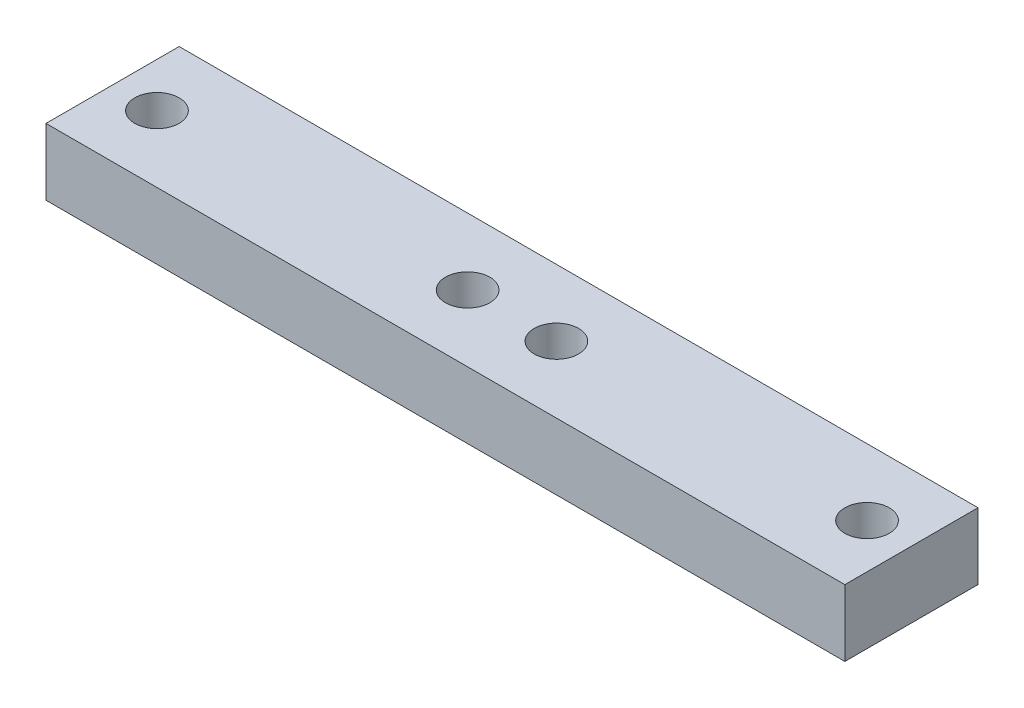
ISO-10303-21;
HEADER;
FILE_DESCRIPTION(('STEP AP214'),'2;1');
FILE_NAME('part.step','',(''),(''),'','','');
FILE_SCHEMA(('AUTOMOTIVE_DESIGN { 1 0 10303 214 1 1 1 1 }'));
ENDSEC;
DATA;
#1=APPLICATION_CONTEXT('core data for automotive mechanical design processes');
#2=APPLICATION_PROTOCOL_DEFINITION('international standard','automotive_design',2000,#1);
#3=PRODUCT_CONTEXT('',#1,'mechanical');
#4=PRODUCT('Part','Part','',(#3));
#5=PRODUCT_RELATED_PRODUCT_CATEGORY('part','',(#4));
#6=PRODUCT_DEFINITION_FORMATION('','',#4);
#7=PRODUCT_DEFINITION_CONTEXT('part definition',#1,'design');
#8=PRODUCT_DEFINITION('design','',#6,#7);
#9=PRODUCT_DEFINITION_SHAPE('','',#8);
#10=(LENGTH_UNIT() NAMED_UNIT(*) SI_UNIT(.MILLI.,.METRE.));
#11=(NAMED_UNIT(*) PLANE_ANGLE_UNIT() SI_UNIT($,.RADIAN.));
#12=(NAMED_UNIT(*) SI_UNIT($,.STERADIAN.) SOLID_ANGLE_UNIT());
#13=UNCERTAINTY_MEASURE_WITH_UNIT(LENGTH_MEASURE(1.E-05),#10,'distance_accuracy_value','');
#14=(GEOMETRIC_REPRESENTATION_CONTEXT(3) GLOBAL_UNCERTAINTY_ASSIGNED_CONTEXT((#13)) GLOBAL_UNIT_ASSIGNED_CONTEXT((#10,
#11,#12)) REPRESENTATION_CONTEXT('',''));
#15=CARTESIAN_POINT('',(0.,0.,0.));
#16=DIRECTION('',(0.,0.,1.));
#17=DIRECTION('',(1.,0.,0.));
#18=AXIS2_PLACEMENT_3D('',#15,#16,#17);
#19=CARTESIAN_POINT('',(0.,6.,0.));
#20=DIRECTION('',(0.,1.,0.));
#21=DIRECTION('',(0.,0.,1.));
#22=AXIS2_PLACEMENT_3D('',#19,#20,#21);
#23=PLANE('',#22);
#24=CARTESIAN_POINT('',(-4.,6.,0.));
#25=DIRECTION('',(0.,1.,0.));
#26=DIRECTION('',(0.,0.,-1.));
#27=AXIS2_PLACEMENT_3D('',#24,#25,#26);
#28=CIRCLE('',#27,2.);
#29=CARTESIAN_POINT('',(-4.,6.,-2.));
#30=VERTEX_POINT('',#29);
#31=EDGE_CURVE('E142',#30,#30,#28,.T.);
#32=ORIENTED_EDGE('',*,*,#31,.F.);
#33=EDGE_LOOP('',(#32));
#34=FACE_BOUND('',#33,.T.);
#35=CARTESIAN_POINT('',(32.,6.,0.));
#36=DIRECTION('',(0.,1.,0.));
#37=DIRECTION('',(0.,0.,1.));
#38=AXIS2_PLACEMENT_3D('',#35,#36,#37);
#39=CIRCLE('',#38,2.);
#40=CARTESIAN_POINT('',(32.,6.,2.));
#41=VERTEX_POINT('',#40);
#42=EDGE_CURVE('E112',#41,#41,#39,.T.);
#43=ORIENTED_EDGE('',*,*,#42,.F.);
#44=EDGE_LOOP('',(#43));
#45=FACE_BOUND('',#44,.T.);
#46=DIRECTION('',(0.,0.,1.));
#47=VECTOR('',#46,1.);
#48=CARTESIAN_POINT('',(-36.,6.,6.));
#49=LINE('',#48,#47);
#50=CARTESIAN_POINT('',(-36.,6.,-6.));
#51=VERTEX_POINT('',#50);
#52=CARTESIAN_POINT('',(-36.,6.,6.));
#53=VERTEX_POINT('',#52);
#54=EDGE_CURVE('E92',#51,#53,#49,.T.);
#55=ORIENTED_EDGE('',*,*,#54,.T.);
#56=DIRECTION('',(1.,0.,0.));
#57=VECTOR('',#56,1.);
#58=CARTESIAN_POINT('',(36.,6.,6.00000000000001));
#59=LINE('',#58,#57);
#60=CARTESIAN_POINT('',(36.,6.,6.00000000000001));
#61=VERTEX_POINT('',#60);
#62=EDGE_CURVE('E87',#53,#61,#59,.T.);
#63=ORIENTED_EDGE('',*,*,#62,.T.);
#64=DIRECTION('',(0.,0.,-1.));
#65=VECTOR('',#64,1.);
#66=CARTESIAN_POINT('',(36.,6.,6.00000000000001));
#67=LINE('',#66,#65);
#68=CARTESIAN_POINT('',(36.,6.,-6.00000000000001));
#69=VERTEX_POINT('',#68);
#70=EDGE_CURVE('E90',#61,#69,#67,.T.);
#71=ORIENTED_EDGE('',*,*,#70,.T.);
#72=DIRECTION('',(-1.,0.,0.));
#73=VECTOR('',#72,1.);
#74=CARTESIAN_POINT('',(36.,6.,-6.00000000000001));
#75=LINE('',#74,#73);
#76=EDGE_CURVE('E57',#69,#51,#75,.T.);
#77=ORIENTED_EDGE('',*,*,#76,.T.);
#78=EDGE_LOOP('',(#55,#63,#71,#77));
#79=FACE_BOUND('',#78,.T.);
#80=CARTESIAN_POINT('',(4.,6.,0.));
#81=DIRECTION('',(0.,1.,0.));
#82=DIRECTION('',(0.,0.,1.));
#83=AXIS2_PLACEMENT_3D('',#80,#81,#82);
#84=CIRCLE('',#83,2.);
#85=CARTESIAN_POINT('',(4.,6.,2.));
#86=VERTEX_POINT('',#85);
#87=EDGE_CURVE('E134',#86,#86,#84,.T.);
#88=ORIENTED_EDGE('',*,*,#87,.F.);
#89=EDGE_LOOP('',(#88));
#90=FACE_BOUND('',#89,.T.);
#91=CARTESIAN_POINT('',(-32.,6.,0.));
#92=DIRECTION('',(0.,1.,0.));
#93=DIRECTION('',(0.,0.,-1.));
#94=AXIS2_PLACEMENT_3D('',#91,#92,#93);
#95=CIRCLE('',#94,2.);
#96=CARTESIAN_POINT('',(-32.,6.,-2.));
#97=VERTEX_POINT('',#96);
#98=EDGE_CURVE('E150',#97,#97,#95,.T.);
#99=ORIENTED_EDGE('',*,*,#98,.F.);
#100=EDGE_LOOP('',(#99));
#101=FACE_BOUND('',#100,.T.);
#102=ADVANCED_FACE('F39',(#34,#45,#79,#90,#101),#23,.T.);
#103=CARTESIAN_POINT('',(0.,0.,0.));
#104=DIRECTION('',(0.,1.,0.));
#105=DIRECTION('',(0.,0.,1.));
#106=AXIS2_PLACEMENT_3D('',#103,#104,#105);
#107=PLANE('',#106);
#108=DIRECTION('',(0.,0.,1.));
#109=VECTOR('',#108,1.);
#110=CARTESIAN_POINT('',(-36.,0.,6.));
#111=LINE('',#110,#109);
#112=CARTESIAN_POINT('',(-36.,0.,-6.));
#113=VERTEX_POINT('',#112);
#114=CARTESIAN_POINT('',(-36.,0.,6.));
#115=VERTEX_POINT('',#114);
#116=EDGE_CURVE('E108',#113,#115,#111,.T.);
#117=ORIENTED_EDGE('',*,*,#116,.F.);
#118=DIRECTION('',(-1.,0.,0.));
#119=VECTOR('',#118,1.);
#120=CARTESIAN_POINT('',(36.,0.,-6.00000000000001));
#121=LINE('',#120,#119);
#122=CARTESIAN_POINT('',(36.,0.,-6.00000000000001));
#123=VERTEX_POINT('',#122);
#124=EDGE_CURVE('E80',#123,#113,#121,.T.);
#125=ORIENTED_EDGE('',*,*,#124,.F.);
#126=DIRECTION('',(0.,0.,-1.));
#127=VECTOR('',#126,1.);
#128=CARTESIAN_POINT('',(36.,0.,6.00000000000001));
#129=LINE('',#128,#127);
#130=CARTESIAN_POINT('',(36.,0.,6.00000000000001));
#131=VERTEX_POINT('',#130);
#132=EDGE_CURVE('E74',#131,#123,#129,.T.);
#133=ORIENTED_EDGE('',*,*,#132,.F.);
#134=DIRECTION('',(1.,0.,0.));
#135=VECTOR('',#134,1.);
#136=CARTESIAN_POINT('',(36.,0.,6.00000000000001));
#137=LINE('',#136,#135);
#138=EDGE_CURVE('E97',#115,#131,#137,.T.);
#139=ORIENTED_EDGE('',*,*,#138,.F.);
#140=EDGE_LOOP('',(#117,#125,#133,#139));
#141=FACE_BOUND('',#140,.T.);
#142=CARTESIAN_POINT('',(32.,0.,0.));
#143=DIRECTION('',(0.,1.,0.));
#144=DIRECTION('',(0.,0.,1.));
#145=AXIS2_PLACEMENT_3D('',#142,#143,#144);
#146=CIRCLE('',#145,2.);
#147=CARTESIAN_POINT('',(32.,0.,2.));
#148=VERTEX_POINT('',#147);
#149=EDGE_CURVE('E130',#148,#148,#146,.T.);
#150=ORIENTED_EDGE('',*,*,#149,.T.);
#151=EDGE_LOOP('',(#150));
#152=FACE_BOUND('',#151,.T.);
#153=CARTESIAN_POINT('',(4.,0.,0.));
#154=DIRECTION('',(0.,1.,0.));
#155=DIRECTION('',(0.,0.,1.));
#156=AXIS2_PLACEMENT_3D('',#153,#154,#155);
#157=CIRCLE('',#156,2.);
#158=CARTESIAN_POINT('',(4.,0.,2.));
#159=VERTEX_POINT('',#158);
#160=EDGE_CURVE('E138',#159,#159,#157,.T.);
#161=ORIENTED_EDGE('',*,*,#160,.T.);
#162=EDGE_LOOP('',(#161));
#163=FACE_BOUND('',#162,.T.);
#164=CARTESIAN_POINT('',(-4.,0.,0.));
#165=DIRECTION('',(0.,1.,0.));
#166=DIRECTION('',(0.,0.,-1.));
#167=AXIS2_PLACEMENT_3D('',#164,#165,#166);
#168=CIRCLE('',#167,2.);
#169=CARTESIAN_POINT('',(-4.,0.,-2.));
#170=VERTEX_POINT('',#169);
#171=EDGE_CURVE('E146',#170,#170,#168,.T.);
#172=ORIENTED_EDGE('',*,*,#171,.T.);
#173=EDGE_LOOP('',(#172));
#174=FACE_BOUND('',#173,.T.);
#175=CARTESIAN_POINT('',(-32.,0.,0.));
#176=DIRECTION('',(0.,1.,0.));
#177=DIRECTION('',(0.,0.,-1.));
#178=AXIS2_PLACEMENT_3D('',#175,#176,#177);
#179=CIRCLE('',#178,2.);
#180=CARTESIAN_POINT('',(-32.,0.,-2.));
#181=VERTEX_POINT('',#180);
#182=EDGE_CURVE('E154',#181,#181,#179,.T.);
#183=ORIENTED_EDGE('',*,*,#182,.T.);
#184=EDGE_LOOP('',(#183));
#185=FACE_BOUND('',#184,.T.);
#186=ADVANCED_FACE('F125',(#141,#152,#163,#174,#185),#107,.F.);
#187=CARTESIAN_POINT('',(-36.,6.,6.));
#188=DIRECTION('',(1.,0.,0.));
#189=DIRECTION('',(0.,0.,-1.));
#190=AXIS2_PLACEMENT_3D('',#187,#188,#189);
#191=PLANE('',#190);
#192=ORIENTED_EDGE('',*,*,#116,.T.);
#193=DIRECTION('',(0.,-1.,0.));
#194=VECTOR('',#193,1.);
#195=CARTESIAN_POINT('',(-36.,6.,6.));
#196=LINE('',#195,#194);
#197=EDGE_CURVE('E11',#53,#115,#196,.T.);
#198=ORIENTED_EDGE('',*,*,#197,.F.);
#199=ORIENTED_EDGE('',*,*,#54,.F.);
#200=DIRECTION('',(0.,-1.,0.));
#201=VECTOR('',#200,1.);
#202=CARTESIAN_POINT('',(-36.,6.,-6.));
#203=LINE('',#202,#201);
#204=EDGE_CURVE('E104',#51,#113,#203,.T.);
#205=ORIENTED_EDGE('',*,*,#204,.T.);
#206=EDGE_LOOP('',(#192,#198,#199,#205));
#207=FACE_BOUND('',#206,.T.);
#208=ADVANCED_FACE('F41',(#207),#191,.F.);
#209=CARTESIAN_POINT('',(36.,6.,6.00000000000001));
#210=DIRECTION('',(0.,0.,-1.));
#211=DIRECTION('',(-1.,0.,0.));
#212=AXIS2_PLACEMENT_3D('',#209,#210,#211);
#213=PLANE('',#212);
#214=ORIENTED_EDGE('',*,*,#138,.T.);
#215=DIRECTION('',(0.,-1.,0.));
#216=VECTOR('',#215,1.);
#217=CARTESIAN_POINT('',(36.,6.,6.00000000000001));
#218=LINE('',#217,#216);
#219=EDGE_CURVE('E49',#61,#131,#218,.T.);
#220=ORIENTED_EDGE('',*,*,#219,.F.);
#221=ORIENTED_EDGE('',*,*,#62,.F.);
#222=ORIENTED_EDGE('',*,*,#197,.T.);
#223=EDGE_LOOP('',(#214,#220,#221,#222));
#224=FACE_BOUND('',#223,.T.);
#225=ADVANCED_FACE('F96',(#224),#213,.F.);
#226=CARTESIAN_POINT('',(36.,6.,6.00000000000001));
#227=DIRECTION('',(-1.,0.,0.));
#228=DIRECTION('',(0.,0.,1.));
#229=AXIS2_PLACEMENT_3D('',#226,#227,#228);
#230=PLANE('',#229);
#231=ORIENTED_EDGE('',*,*,#132,.T.);
#232=DIRECTION('',(0.,-1.,0.));
#233=VECTOR('',#232,1.);
#234=CARTESIAN_POINT('',(36.,6.,-6.00000000000001));
#235=LINE('',#234,#233);
#236=EDGE_CURVE('E99',#69,#123,#235,.T.);
#237=ORIENTED_EDGE('',*,*,#236,.F.);
#238=ORIENTED_EDGE('',*,*,#70,.F.);
#239=ORIENTED_EDGE('',*,*,#219,.T.);
#240=EDGE_LOOP('',(#231,#237,#238,#239));
#241=FACE_BOUND('',#240,.T.);
#242=ADVANCED_FACE('F100',(#241),#230,.F.);
#243=CARTESIAN_POINT('',(36.,6.,-6.00000000000001));
#244=DIRECTION('',(0.,0.,1.));
#245=DIRECTION('',(1.,0.,0.));
#246=AXIS2_PLACEMENT_3D('',#243,#244,#245);
#247=PLANE('',#246);
#248=ORIENTED_EDGE('',*,*,#124,.T.);
#249=ORIENTED_EDGE('',*,*,#204,.F.);
#250=ORIENTED_EDGE('',*,*,#76,.F.);
#251=ORIENTED_EDGE('',*,*,#236,.T.);
#252=EDGE_LOOP('',(#248,#249,#250,#251));
#253=FACE_BOUND('',#252,.T.);
#254=ADVANCED_FACE('F122',(#253),#247,.F.);
#255=CARTESIAN_POINT('',(32.,6.,0.));
#256=DIRECTION('',(0.,-1.,0.));
#257=DIRECTION('',(0.,0.,-1.));
#258=AXIS2_PLACEMENT_3D('',#255,#256,#257);
#259=CYLINDRICAL_SURFACE('',#258,2.);
#260=ORIENTED_EDGE('',*,*,#42,.T.);
#261=EDGE_LOOP('',(#260));
#262=FACE_BOUND('',#261,.T.);
#263=ORIENTED_EDGE('',*,*,#149,.F.);
#264=EDGE_LOOP('',(#263));
#265=FACE_BOUND('',#264,.T.);
#266=ADVANCED_FACE('F175',(#262,#265),#259,.F.);
#267=CARTESIAN_POINT('',(4.,6.,0.));
#268=DIRECTION('',(0.,-1.,0.));
#269=DIRECTION('',(0.,0.,-1.));
#270=AXIS2_PLACEMENT_3D('',#267,#268,#269);
#271=CYLINDRICAL_SURFACE('',#270,2.);
#272=ORIENTED_EDGE('',*,*,#87,.T.);
#273=EDGE_LOOP('',(#272));
#274=FACE_BOUND('',#273,.T.);
#275=ORIENTED_EDGE('',*,*,#160,.F.);
#276=EDGE_LOOP('',(#275));
#277=FACE_BOUND('',#276,.T.);
#278=ADVANCED_FACE('F221',(#274,#277),#271,.F.);
#279=CARTESIAN_POINT('',(-4.,6.,0.));
#280=DIRECTION('',(0.,-1.,0.));
#281=DIRECTION('',(0.,0.,-1.));
#282=AXIS2_PLACEMENT_3D('',#279,#280,#281);
#283=CYLINDRICAL_SURFACE('',#282,2.);
#284=ORIENTED_EDGE('',*,*,#31,.T.);
#285=EDGE_LOOP('',(#284));
#286=FACE_BOUND('',#285,.T.);
#287=ORIENTED_EDGE('',*,*,#171,.F.);
#288=EDGE_LOOP('',(#287));
#289=FACE_BOUND('',#288,.T.);
#290=ADVANCED_FACE('F229',(#286,#289),#283,.F.);
#291=CARTESIAN_POINT('',(-32.,6.,0.));
#292=DIRECTION('',(0.,-1.,0.));
#293=DIRECTION('',(0.,0.,-1.));
#294=AXIS2_PLACEMENT_3D('',#291,#292,#293);
#295=CYLINDRICAL_SURFACE('',#294,2.);
#296=ORIENTED_EDGE('',*,*,#98,.T.);
#297=EDGE_LOOP('',(#296));
#298=FACE_BOUND('',#297,.T.);
#299=ORIENTED_EDGE('',*,*,#182,.F.);
#300=EDGE_LOOP('',(#299));
#301=FACE_BOUND('',#300,.T.);
#302=ADVANCED_FACE('F162',(#298,#301),#295,.F.);
#303=CLOSED_SHELL('',(#102,#186,#208,#225,#242,#254,#266,#278,#290,#302));
#304=MANIFOLD_SOLID_BREP('B2',#303);
#305=ADVANCED_BREP_SHAPE_REPRESENTATION('',(#18,#304),#14);
#306=SHAPE_DEFINITION_REPRESENTATION(#9,#305);
ENDSEC;
END-ISO-10303-21;
